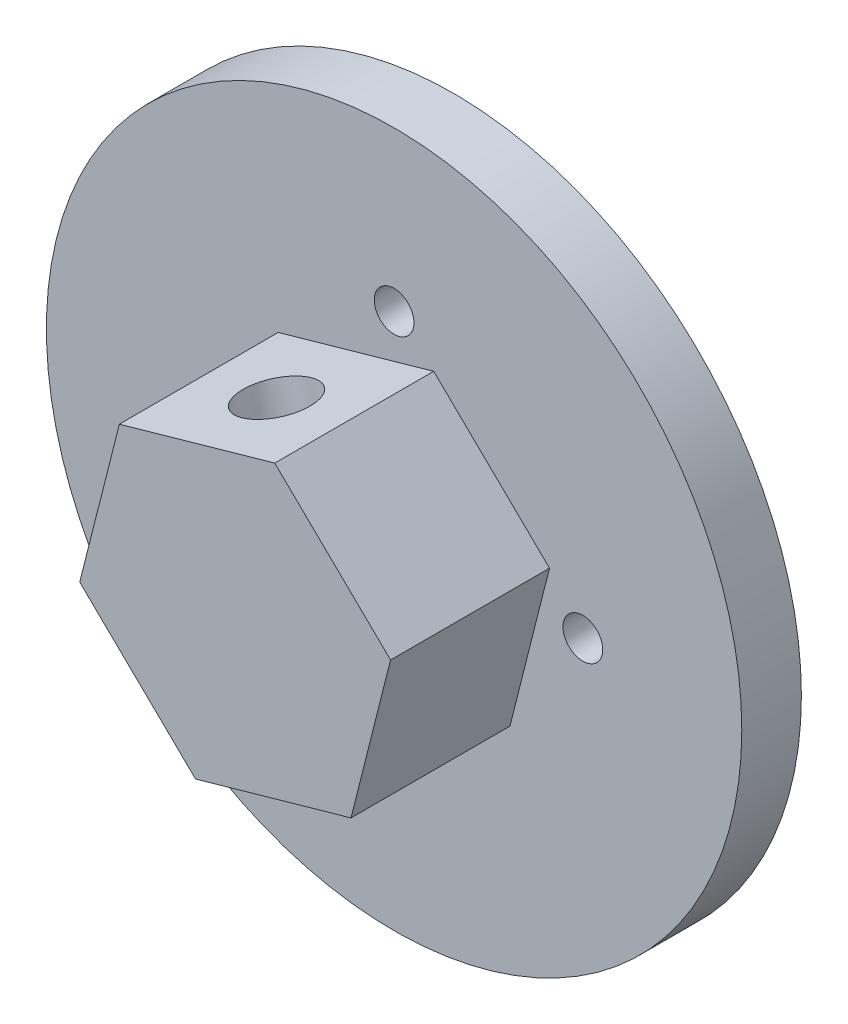
ISO-10303-21;
HEADER;
FILE_DESCRIPTION(('STEP AP214'),'2;1');
FILE_NAME('part.step','',(''),(''),'','','');
FILE_SCHEMA(('AUTOMOTIVE_DESIGN { 1 0 10303 214 1 1 1 1 }'));
ENDSEC;
DATA;
#1=APPLICATION_CONTEXT('core data for automotive mechanical design processes');
#2=APPLICATION_PROTOCOL_DEFINITION('international standard','automotive_design',2000,#1);
#3=PRODUCT_CONTEXT('',#1,'mechanical');
#4=PRODUCT('Part','Part','',(#3));
#5=PRODUCT_RELATED_PRODUCT_CATEGORY('part','',(#4));
#6=PRODUCT_DEFINITION_FORMATION('','',#4);
#7=PRODUCT_DEFINITION_CONTEXT('part definition',#1,'design');
#8=PRODUCT_DEFINITION('design','',#6,#7);
#9=PRODUCT_DEFINITION_SHAPE('','',#8);
#10=(LENGTH_UNIT() NAMED_UNIT(*) SI_UNIT(.MILLI.,.METRE.));
#11=(NAMED_UNIT(*) PLANE_ANGLE_UNIT() SI_UNIT($,.RADIAN.));
#12=(NAMED_UNIT(*) SI_UNIT($,.STERADIAN.) SOLID_ANGLE_UNIT());
#13=UNCERTAINTY_MEASURE_WITH_UNIT(LENGTH_MEASURE(1.E-05),#10,'distance_accuracy_value','');
#14=(GEOMETRIC_REPRESENTATION_CONTEXT(3) GLOBAL_UNCERTAINTY_ASSIGNED_CONTEXT((#13)) GLOBAL_UNIT_ASSIGNED_CONTEXT((#10,
#11,#12)) REPRESENTATION_CONTEXT('',''));
#15=CARTESIAN_POINT('',(0.,0.,0.));
#16=DIRECTION('',(0.,0.,1.));
#17=DIRECTION('',(1.,0.,0.));
#18=AXIS2_PLACEMENT_3D('',#15,#16,#17);
#19=CARTESIAN_POINT('',(0.,0.,3.));
#20=DIRECTION('',(0.,0.,1.));
#21=DIRECTION('',(1.,0.,0.));
#22=AXIS2_PLACEMENT_3D('',#19,#20,#21);
#23=PLANE('',#22);
#24=CARTESIAN_POINT('',(5.37685650259296E-13,-9.5,3.));
#25=DIRECTION('',(0.,0.,1.));
#26=DIRECTION('',(1.,0.,0.));
#27=AXIS2_PLACEMENT_3D('',#24,#25,#26);
#28=CIRCLE('',#27,1.00000000000058);
#29=CARTESIAN_POINT('',(1.00000000000112,-9.5,3.));
#30=VERTEX_POINT('',#29);
#31=EDGE_CURVE('E145',#30,#30,#28,.T.);
#32=ORIENTED_EDGE('',*,*,#31,.F.);
#33=EDGE_LOOP('',(#32));
#34=FACE_BOUND('',#33,.T.);
#35=CARTESIAN_POINT('',(0.,9.5,3.));
#36=DIRECTION('',(0.,0.,1.));
#37=DIRECTION('',(1.,0.,0.));
#38=AXIS2_PLACEMENT_3D('',#35,#36,#37);
#39=CIRCLE('',#38,1.);
#40=CARTESIAN_POINT('',(1.,9.5,3.));
#41=VERTEX_POINT('',#40);
#42=EDGE_CURVE('E157',#41,#41,#39,.T.);
#43=ORIENTED_EDGE('',*,*,#42,.F.);
#44=EDGE_LOOP('',(#43));
#45=FACE_BOUND('',#44,.T.);
#46=CARTESIAN_POINT('',(0.,0.,3.));
#47=DIRECTION('',(0.,0.,1.));
#48=DIRECTION('',(1.,0.,0.));
#49=AXIS2_PLACEMENT_3D('',#46,#47,#48);
#50=CIRCLE('',#49,17.5);
#51=CARTESIAN_POINT('',(17.5,0.,3.));
#52=VERTEX_POINT('',#51);
#53=EDGE_CURVE('E11',#52,#52,#50,.T.);
#54=ORIENTED_EDGE('',*,*,#53,.T.);
#55=EDGE_LOOP('',(#54));
#56=FACE_BOUND('',#55,.T.);
#57=CARTESIAN_POINT('',(9.50000000000027,2.68842825129648E-13,3.));
#58=DIRECTION('',(0.,0.,1.));
#59=DIRECTION('',(1.,0.,0.));
#60=AXIS2_PLACEMENT_3D('',#57,#58,#59);
#61=CIRCLE('',#60,1.00000000000021);
#62=CARTESIAN_POINT('',(10.5000000000005,2.68842825129648E-13,3.));
#63=VERTEX_POINT('',#62);
#64=EDGE_CURVE('E151',#63,#63,#61,.T.);
#65=ORIENTED_EDGE('',*,*,#64,.F.);
#66=EDGE_LOOP('',(#65));
#67=FACE_BOUND('',#66,.T.);
#68=CARTESIAN_POINT('',(-9.49999999999973,-2.70006239588838E-13,3.));
#69=DIRECTION('',(0.,0.,1.));
#70=DIRECTION('',(1.,0.,0.));
#71=AXIS2_PLACEMENT_3D('',#68,#69,#70);
#72=CIRCLE('',#71,1.00000000000043);
#73=CARTESIAN_POINT('',(-8.4999999999993,-2.70006239588838E-13,3.));
#74=VERTEX_POINT('',#73);
#75=EDGE_CURVE('E139',#74,#74,#72,.T.);
#76=ORIENTED_EDGE('',*,*,#75,.F.);
#77=EDGE_LOOP('',(#76));
#78=FACE_BOUND('',#77,.T.);
#79=DIRECTION('',(-0.962191103851653,-0.272375255243089,0.));
#80=VECTOR('',#79,1.);
#81=CARTESIAN_POINT('',(1.99357900634263,7.88181999078198,3.));
#82=LINE('',#81,#80);
#83=CARTESIAN_POINT('',(1.99357900634263,7.88181999078198,3.));
#84=VERTEX_POINT('',#83);
#85=CARTESIAN_POINT('',(-5.82906683690191,5.66740005933505,3.));
#86=VERTEX_POINT('',#85);
#87=EDGE_CURVE('E120',#84,#86,#82,.T.);
#88=ORIENTED_EDGE('',*,*,#87,.F.);
#89=DIRECTION('',(-0.716979442328612,0.697094311609377,0.));
#90=VECTOR('',#89,1.);
#91=CARTESIAN_POINT('',(7.82264584324454,2.21441993144693,3.));
#92=LINE('',#91,#90);
#93=CARTESIAN_POINT('',(7.82264584324454,2.21441993144693,3.));
#94=VERTEX_POINT('',#93);
#95=EDGE_CURVE('E117',#94,#84,#92,.T.);
#96=ORIENTED_EDGE('',*,*,#95,.F.);
#97=DIRECTION('',(0.24521166152304,0.969469566852467,0.));
#98=VECTOR('',#97,1.);
#99=CARTESIAN_POINT('',(5.82906683690191,-5.66740005933505,3.));
#100=LINE('',#99,#98);
#101=CARTESIAN_POINT('',(5.82906683690191,-5.66740005933505,3.));
#102=VERTEX_POINT('',#101);
#103=EDGE_CURVE('E76',#102,#94,#100,.T.);
#104=ORIENTED_EDGE('',*,*,#103,.F.);
#105=DIRECTION('',(0.962191103851653,0.27237525524309,0.));
#106=VECTOR('',#105,1.);
#107=CARTESIAN_POINT('',(-1.99357900634263,-7.88181999078199,3.));
#108=LINE('',#107,#106);
#109=CARTESIAN_POINT('',(-1.99357900634263,-7.88181999078199,3.));
#110=VERTEX_POINT('',#109);
#111=EDGE_CURVE('E126',#110,#102,#108,.T.);
#112=ORIENTED_EDGE('',*,*,#111,.F.);
#113=DIRECTION('',(0.716979442328613,-0.697094311609378,0.));
#114=VECTOR('',#113,1.);
#115=CARTESIAN_POINT('',(-7.82264584324454,-2.21441993144693,3.));
#116=LINE('',#115,#114);
#117=CARTESIAN_POINT('',(-7.82264584324454,-2.21441993144693,3.));
#118=VERTEX_POINT('',#117);
#119=EDGE_CURVE('E106',#118,#110,#116,.T.);
#120=ORIENTED_EDGE('',*,*,#119,.F.);
#121=DIRECTION('',(-0.24521166152304,-0.969469566852467,0.));
#122=VECTOR('',#121,1.);
#123=CARTESIAN_POINT('',(-5.82906683690191,5.66740005933505,3.));
#124=LINE('',#123,#122);
#125=EDGE_CURVE('E123',#86,#118,#124,.T.);
#126=ORIENTED_EDGE('',*,*,#125,.F.);
#127=EDGE_LOOP('',(#88,#96,#104,#112,#120,#126));
#128=FACE_BOUND('',#127,.T.);
#129=ADVANCED_FACE('F33',(#34,#45,#56,#67,#78,#128),#23,.T.);
#130=CARTESIAN_POINT('',(0.,0.,0.));
#131=DIRECTION('',(0.,0.,1.));
#132=DIRECTION('',(1.,0.,0.));
#133=AXIS2_PLACEMENT_3D('',#130,#131,#132);
#134=PLANE('',#133);
#135=CARTESIAN_POINT('',(0.,0.,0.));
#136=DIRECTION('',(0.,0.,1.));
#137=DIRECTION('',(1.,0.,0.));
#138=AXIS2_PLACEMENT_3D('',#135,#136,#137);
#139=CIRCLE('',#138,17.5);
#140=CARTESIAN_POINT('',(17.5,0.,0.));
#141=VERTEX_POINT('',#140);
#142=EDGE_CURVE('E37',#141,#141,#139,.T.);
#143=ORIENTED_EDGE('',*,*,#142,.F.);
#144=EDGE_LOOP('',(#143));
#145=FACE_BOUND('',#144,.T.);
#146=CARTESIAN_POINT('',(0.,9.5,0.));
#147=DIRECTION('',(0.,0.,1.));
#148=DIRECTION('',(1.,0.,0.));
#149=AXIS2_PLACEMENT_3D('',#146,#147,#148);
#150=CIRCLE('',#149,1.);
#151=CARTESIAN_POINT('',(1.,9.5,0.));
#152=VERTEX_POINT('',#151);
#153=EDGE_CURVE('E154',#152,#152,#150,.T.);
#154=ORIENTED_EDGE('',*,*,#153,.T.);
#155=EDGE_LOOP('',(#154));
#156=FACE_BOUND('',#155,.T.);
#157=CARTESIAN_POINT('',(9.50000000000027,2.68842825129648E-13,0.));
#158=DIRECTION('',(0.,0.,1.));
#159=DIRECTION('',(1.,0.,0.));
#160=AXIS2_PLACEMENT_3D('',#157,#158,#159);
#161=CIRCLE('',#160,1.00000000000021);
#162=CARTESIAN_POINT('',(10.5000000000005,2.68842825129648E-13,0.));
#163=VERTEX_POINT('',#162);
#164=EDGE_CURVE('E148',#163,#163,#161,.T.);
#165=ORIENTED_EDGE('',*,*,#164,.T.);
#166=EDGE_LOOP('',(#165));
#167=FACE_BOUND('',#166,.T.);
#168=CARTESIAN_POINT('',(5.37685650259296E-13,-9.5,0.));
#169=DIRECTION('',(0.,0.,1.));
#170=DIRECTION('',(1.,0.,0.));
#171=AXIS2_PLACEMENT_3D('',#168,#169,#170);
#172=CIRCLE('',#171,1.00000000000058);
#173=CARTESIAN_POINT('',(1.00000000000112,-9.5,0.));
#174=VERTEX_POINT('',#173);
#175=EDGE_CURVE('E142',#174,#174,#172,.T.);
#176=ORIENTED_EDGE('',*,*,#175,.T.);
#177=EDGE_LOOP('',(#176));
#178=FACE_BOUND('',#177,.T.);
#179=CARTESIAN_POINT('',(-9.49999999999973,-2.70006239588838E-13,0.));
#180=DIRECTION('',(0.,0.,1.));
#181=DIRECTION('',(1.,0.,0.));
#182=AXIS2_PLACEMENT_3D('',#179,#180,#181);
#183=CIRCLE('',#182,1.00000000000043);
#184=CARTESIAN_POINT('',(-8.4999999999993,-2.70006239588838E-13,0.));
#185=VERTEX_POINT('',#184);
#186=EDGE_CURVE('E138',#185,#185,#183,.T.);
#187=ORIENTED_EDGE('',*,*,#186,.T.);
#188=EDGE_LOOP('',(#187));
#189=FACE_BOUND('',#188,.T.);
#190=ADVANCED_FACE('F163',(#145,#156,#167,#178,#189),#134,.F.);
#191=CARTESIAN_POINT('',(0.,0.,3.));
#192=DIRECTION('',(0.,0.,-1.));
#193=DIRECTION('',(-1.,0.,0.));
#194=AXIS2_PLACEMENT_3D('',#191,#192,#193);
#195=CYLINDRICAL_SURFACE('',#194,17.5);
#196=ORIENTED_EDGE('',*,*,#53,.F.);
#197=EDGE_LOOP('',(#196));
#198=FACE_BOUND('',#197,.T.);
#199=ORIENTED_EDGE('',*,*,#142,.T.);
#200=EDGE_LOOP('',(#199));
#201=FACE_BOUND('',#200,.T.);
#202=ADVANCED_FACE('F35',(#198,#201),#195,.T.);
#203=CARTESIAN_POINT('',(0.,9.5,3.));
#204=DIRECTION('',(0.,0.,-1.));
#205=DIRECTION('',(-1.,0.,0.));
#206=AXIS2_PLACEMENT_3D('',#203,#204,#205);
#207=CYLINDRICAL_SURFACE('',#206,1.);
#208=ORIENTED_EDGE('',*,*,#42,.T.);
#209=EDGE_LOOP('',(#208));
#210=FACE_BOUND('',#209,.T.);
#211=ORIENTED_EDGE('',*,*,#153,.F.);
#212=EDGE_LOOP('',(#211));
#213=FACE_BOUND('',#212,.T.);
#214=ADVANCED_FACE('F166',(#210,#213),#207,.F.);
#215=CARTESIAN_POINT('',(9.50000000000027,2.68842825129648E-13,3.));
#216=DIRECTION('',(0.,0.,-1.));
#217=DIRECTION('',(-1.,0.,0.));
#218=AXIS2_PLACEMENT_3D('',#215,#216,#217);
#219=CYLINDRICAL_SURFACE('',#218,1.00000000000021);
#220=ORIENTED_EDGE('',*,*,#64,.T.);
#221=EDGE_LOOP('',(#220));
#222=FACE_BOUND('',#221,.T.);
#223=ORIENTED_EDGE('',*,*,#164,.F.);
#224=EDGE_LOOP('',(#223));
#225=FACE_BOUND('',#224,.T.);
#226=ADVANCED_FACE('F168',(#222,#225),#219,.F.);
#227=CARTESIAN_POINT('',(5.37685650259296E-13,-9.5,3.));
#228=DIRECTION('',(0.,0.,-1.));
#229=DIRECTION('',(-1.,0.,0.));
#230=AXIS2_PLACEMENT_3D('',#227,#228,#229);
#231=CYLINDRICAL_SURFACE('',#230,1.00000000000058);
#232=ORIENTED_EDGE('',*,*,#31,.T.);
#233=EDGE_LOOP('',(#232));
#234=FACE_BOUND('',#233,.T.);
#235=ORIENTED_EDGE('',*,*,#175,.F.);
#236=EDGE_LOOP('',(#235));
#237=FACE_BOUND('',#236,.T.);
#238=ADVANCED_FACE('F175',(#234,#237),#231,.F.);
#239=CARTESIAN_POINT('',(-9.49999999999973,-2.70006239588838E-13,3.));
#240=DIRECTION('',(0.,0.,-1.));
#241=DIRECTION('',(-1.,0.,0.));
#242=AXIS2_PLACEMENT_3D('',#239,#240,#241);
#243=CYLINDRICAL_SURFACE('',#242,1.00000000000043);
#244=ORIENTED_EDGE('',*,*,#75,.T.);
#245=EDGE_LOOP('',(#244));
#246=FACE_BOUND('',#245,.T.);
#247=ORIENTED_EDGE('',*,*,#186,.F.);
#248=EDGE_LOOP('',(#247));
#249=FACE_BOUND('',#248,.T.);
#250=ADVANCED_FACE('F234',(#246,#249),#243,.F.);
#251=CARTESIAN_POINT('',(7.82264584324454,2.21441993144693,11.));
#252=DIRECTION('',(-0.697094311609378,-0.716979442328613,0.));
#253=DIRECTION('',(0.716979442328613,-0.697094311609378,0.));
#254=AXIS2_PLACEMENT_3D('',#251,#252,#253);
#255=PLANE('',#254);
#256=ORIENTED_EDGE('',*,*,#95,.T.);
#257=DIRECTION('',(0.,0.,-1.));
#258=VECTOR('',#257,1.);
#259=CARTESIAN_POINT('',(1.99357900634263,7.88181999078198,11.));
#260=LINE('',#259,#258);
#261=CARTESIAN_POINT('',(1.99357900634263,7.88181999078198,11.));
#262=VERTEX_POINT('',#261);
#263=EDGE_CURVE('E136',#262,#84,#260,.T.);
#264=ORIENTED_EDGE('',*,*,#263,.F.);
#265=DIRECTION('',(-0.716979442328612,0.697094311609377,0.));
#266=VECTOR('',#265,1.);
#267=CARTESIAN_POINT('',(7.82264584324454,2.21441993144693,11.));
#268=LINE('',#267,#266);
#269=CARTESIAN_POINT('',(7.82264584324454,2.21441993144693,11.));
#270=VERTEX_POINT('',#269);
#271=EDGE_CURVE('E129',#270,#262,#268,.T.);
#272=ORIENTED_EDGE('',*,*,#271,.F.);
#273=DIRECTION('',(0.,0.,-1.));
#274=VECTOR('',#273,1.);
#275=CARTESIAN_POINT('',(7.82264584324454,2.21441993144693,11.));
#276=LINE('',#275,#274);
#277=EDGE_CURVE('E113',#270,#94,#276,.T.);
#278=ORIENTED_EDGE('',*,*,#277,.T.);
#279=EDGE_LOOP('',(#256,#264,#272,#278));
#280=FACE_BOUND('',#279,.T.);
#281=ADVANCED_FACE('F230',(#280),#255,.F.);
#282=CARTESIAN_POINT('',(1.99357900634263,7.88181999078198,11.));
#283=DIRECTION('',(0.272375255243089,-0.962191103851653,0.));
#284=DIRECTION('',(0.962191103851653,0.272375255243089,0.));
#285=AXIS2_PLACEMENT_3D('',#282,#283,#284);
#286=PLANE('',#285);
#287=CARTESIAN_POINT('',(-1.91774391527964,6.77461002505851,7.));
#288=DIRECTION('',(0.272375255243089,-0.962191103851653,0.));
#289=DIRECTION('',(0.962191103851653,0.272375255243089,0.));
#290=AXIS2_PLACEMENT_3D('',#287,#288,#289);
#291=CIRCLE('',#290,1.75);
#292=CARTESIAN_POINT('',(-0.233909483539247,7.25126672173392,7.));
#293=VERTEX_POINT('',#292);
#294=EDGE_CURVE('E121',#293,#293,#291,.F.);
#295=ORIENTED_EDGE('',*,*,#294,.F.);
#296=EDGE_LOOP('',(#295));
#297=FACE_BOUND('',#296,.T.);
#298=ORIENTED_EDGE('',*,*,#87,.T.);
#299=DIRECTION('',(0.,0.,-1.));
#300=VECTOR('',#299,1.);
#301=CARTESIAN_POINT('',(-5.82906683690191,5.66740005933505,11.));
#302=LINE('',#301,#300);
#303=CARTESIAN_POINT('',(-5.82906683690191,5.66740005933505,11.));
#304=VERTEX_POINT('',#303);
#305=EDGE_CURVE('E133',#304,#86,#302,.T.);
#306=ORIENTED_EDGE('',*,*,#305,.F.);
#307=DIRECTION('',(-0.962191103851653,-0.272375255243089,0.));
#308=VECTOR('',#307,1.);
#309=CARTESIAN_POINT('',(1.99357900634263,7.88181999078198,11.));
#310=LINE('',#309,#308);
#311=EDGE_CURVE('E84',#262,#304,#310,.T.);
#312=ORIENTED_EDGE('',*,*,#311,.F.);
#313=ORIENTED_EDGE('',*,*,#263,.T.);
#314=EDGE_LOOP('',(#298,#306,#312,#313));
#315=FACE_BOUND('',#314,.T.);
#316=ADVANCED_FACE('F199',(#297,#315),#286,.F.);
#317=CARTESIAN_POINT('',(-5.82906683690191,5.66740005933505,11.));
#318=DIRECTION('',(0.969469566852467,-0.24521166152304,0.));
#319=DIRECTION('',(0.24521166152304,0.969469566852467,0.));
#320=AXIS2_PLACEMENT_3D('',#317,#318,#319);
#321=PLANE('',#320);
#322=ORIENTED_EDGE('',*,*,#125,.T.);
#323=DIRECTION('',(0.,0.,-1.));
#324=VECTOR('',#323,1.);
#325=CARTESIAN_POINT('',(-7.82264584324454,-2.21441993144693,11.));
#326=LINE('',#325,#324);
#327=CARTESIAN_POINT('',(-7.82264584324454,-2.21441993144693,11.));
#328=VERTEX_POINT('',#327);
#329=EDGE_CURVE('E109',#328,#118,#326,.T.);
#330=ORIENTED_EDGE('',*,*,#329,.F.);
#331=DIRECTION('',(-0.24521166152304,-0.969469566852467,0.));
#332=VECTOR('',#331,1.);
#333=CARTESIAN_POINT('',(-5.82906683690191,5.66740005933505,11.));
#334=LINE('',#333,#332);
#335=EDGE_CURVE('E97',#304,#328,#334,.T.);
#336=ORIENTED_EDGE('',*,*,#335,.F.);
#337=ORIENTED_EDGE('',*,*,#305,.T.);
#338=EDGE_LOOP('',(#322,#330,#336,#337));
#339=FACE_BOUND('',#338,.T.);
#340=ADVANCED_FACE('F202',(#339),#321,.F.);
#341=CARTESIAN_POINT('',(-7.82264584324454,-2.21441993144693,11.));
#342=DIRECTION('',(0.697094311609377,0.716979442328613,0.));
#343=DIRECTION('',(-0.716979442328613,0.697094311609377,0.));
#344=AXIS2_PLACEMENT_3D('',#341,#342,#343);
#345=PLANE('',#344);
#346=ORIENTED_EDGE('',*,*,#119,.T.);
#347=DIRECTION('',(0.,0.,-1.));
#348=VECTOR('',#347,1.);
#349=CARTESIAN_POINT('',(-1.99357900634263,-7.88181999078199,11.));
#350=LINE('',#349,#348);
#351=CARTESIAN_POINT('',(-1.99357900634263,-7.88181999078199,11.));
#352=VERTEX_POINT('',#351);
#353=EDGE_CURVE('E103',#352,#110,#350,.T.);
#354=ORIENTED_EDGE('',*,*,#353,.F.);
#355=DIRECTION('',(0.716979442328613,-0.697094311609378,0.));
#356=VECTOR('',#355,1.);
#357=CARTESIAN_POINT('',(-7.82264584324454,-2.21441993144693,11.));
#358=LINE('',#357,#356);
#359=EDGE_CURVE('E91',#328,#352,#358,.T.);
#360=ORIENTED_EDGE('',*,*,#359,.F.);
#361=ORIENTED_EDGE('',*,*,#329,.T.);
#362=EDGE_LOOP('',(#346,#354,#360,#361));
#363=FACE_BOUND('',#362,.T.);
#364=ADVANCED_FACE('F104',(#363),#345,.F.);
#365=CARTESIAN_POINT('',(-1.99357900634263,-7.88181999078199,11.));
#366=DIRECTION('',(-0.27237525524309,0.962191103851653,0.));
#367=DIRECTION('',(-0.962191103851653,-0.27237525524309,0.));
#368=AXIS2_PLACEMENT_3D('',#365,#366,#367);
#369=PLANE('',#368);
#370=CARTESIAN_POINT('',(1.91774391527964,-6.77461002505852,7.));
#371=DIRECTION('',(0.27237525524309,-0.962191103851653,0.));
#372=DIRECTION('',(0.962191103851653,0.27237525524309,0.));
#373=AXIS2_PLACEMENT_3D('',#370,#371,#372);
#374=CIRCLE('',#373,1.75);
#375=CARTESIAN_POINT('',(3.60157834702003,-6.29795332838311,7.));
#376=VERTEX_POINT('',#375);
#377=EDGE_CURVE('E208',#376,#376,#374,.T.);
#378=ORIENTED_EDGE('',*,*,#377,.F.);
#379=EDGE_LOOP('',(#378));
#380=FACE_BOUND('',#379,.T.);
#381=ORIENTED_EDGE('',*,*,#111,.T.);
#382=DIRECTION('',(0.,0.,-1.));
#383=VECTOR('',#382,1.);
#384=CARTESIAN_POINT('',(5.82906683690191,-5.66740005933505,11.));
#385=LINE('',#384,#383);
#386=CARTESIAN_POINT('',(5.82906683690191,-5.66740005933505,11.));
#387=VERTEX_POINT('',#386);
#388=EDGE_CURVE('E48',#387,#102,#385,.T.);
#389=ORIENTED_EDGE('',*,*,#388,.F.);
#390=DIRECTION('',(0.962191103851653,0.27237525524309,0.));
#391=VECTOR('',#390,1.);
#392=CARTESIAN_POINT('',(-1.99357900634263,-7.88181999078199,11.));
#393=LINE('',#392,#391);
#394=EDGE_CURVE('E95',#352,#387,#393,.T.);
#395=ORIENTED_EDGE('',*,*,#394,.F.);
#396=ORIENTED_EDGE('',*,*,#353,.T.);
#397=EDGE_LOOP('',(#381,#389,#395,#396));
#398=FACE_BOUND('',#397,.T.);
#399=ADVANCED_FACE('F111',(#380,#398),#369,.F.);
#400=CARTESIAN_POINT('',(5.82906683690191,-5.66740005933505,11.));
#401=DIRECTION('',(-0.969469566852467,0.24521166152304,0.));
#402=DIRECTION('',(-0.24521166152304,-0.969469566852467,0.));
#403=AXIS2_PLACEMENT_3D('',#400,#401,#402);
#404=PLANE('',#403);
#405=ORIENTED_EDGE('',*,*,#103,.T.);
#406=ORIENTED_EDGE('',*,*,#277,.F.);
#407=DIRECTION('',(0.24521166152304,0.969469566852467,0.));
#408=VECTOR('',#407,1.);
#409=CARTESIAN_POINT('',(5.82906683690191,-5.66740005933505,11.));
#410=LINE('',#409,#408);
#411=EDGE_CURVE('E56',#387,#270,#410,.T.);
#412=ORIENTED_EDGE('',*,*,#411,.F.);
#413=ORIENTED_EDGE('',*,*,#388,.T.);
#414=EDGE_LOOP('',(#405,#406,#412,#413));
#415=FACE_BOUND('',#414,.T.);
#416=ADVANCED_FACE('F216',(#415),#404,.F.);
#417=CARTESIAN_POINT('',(0.,0.,11.));
#418=DIRECTION('',(0.,0.,1.));
#419=DIRECTION('',(1.,0.,0.));
#420=AXIS2_PLACEMENT_3D('',#417,#418,#419);
#421=PLANE('',#420);
#422=ORIENTED_EDGE('',*,*,#271,.T.);
#423=ORIENTED_EDGE('',*,*,#311,.T.);
#424=ORIENTED_EDGE('',*,*,#335,.T.);
#425=ORIENTED_EDGE('',*,*,#359,.T.);
#426=ORIENTED_EDGE('',*,*,#394,.T.);
#427=ORIENTED_EDGE('',*,*,#411,.T.);
#428=EDGE_LOOP('',(#422,#423,#424,#425,#426,#427));
#429=FACE_BOUND('',#428,.T.);
#430=ADVANCED_FACE('F93',(#429),#421,.T.);
#431=CARTESIAN_POINT('',(-5.88497949085401,20.7892413258888,7.));
#432=DIRECTION('',(0.27237525524309,-0.962191103851653,0.));
#433=DIRECTION('',(0.962191103851653,0.27237525524309,0.));
#434=AXIS2_PLACEMENT_3D('',#431,#432,#433);
#435=CYLINDRICAL_SURFACE('',#434,1.75);
#436=ORIENTED_EDGE('',*,*,#377,.T.);
#437=EDGE_LOOP('',(#436));
#438=FACE_BOUND('',#437,.T.);
#439=ORIENTED_EDGE('',*,*,#294,.T.);
#440=EDGE_LOOP('',(#439));
#441=FACE_BOUND('',#440,.T.);
#442=ADVANCED_FACE('F212',(#438,#441),#435,.F.);
#443=CLOSED_SHELL('',(#129,#190,#202,#214,#226,#238,#250,#281,#316,#340,#364,#399,#416,#430,#442));
#444=MANIFOLD_SOLID_BREP('B2',#443);
#445=ADVANCED_BREP_SHAPE_REPRESENTATION('',(#18,#444),#14);
#446=SHAPE_DEFINITION_REPRESENTATION(#9,#445);
ENDSEC;
END-ISO-10303-21;
